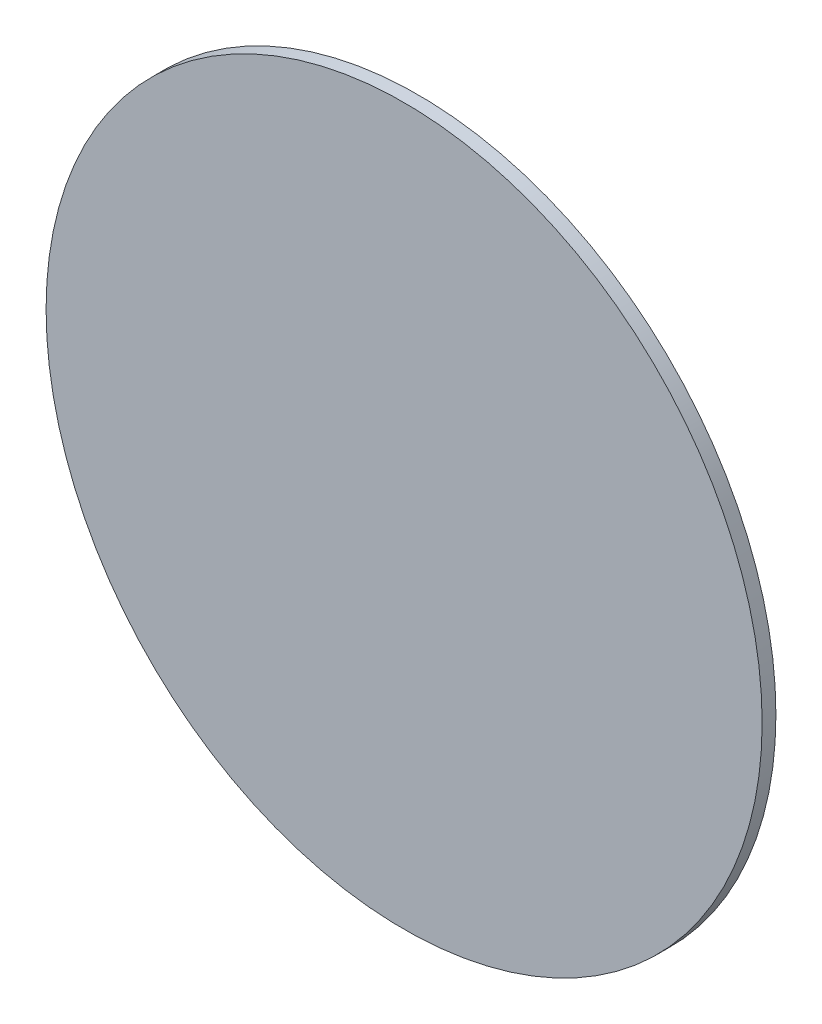
ISO-10303-21;
HEADER;
FILE_DESCRIPTION(('STEP AP214'),'2;1');
FILE_NAME('part.step','',(''),(''),'','','');
FILE_SCHEMA(('AUTOMOTIVE_DESIGN { 1 0 10303 214 1 1 1 1 }'));
ENDSEC;
DATA;
#1=APPLICATION_CONTEXT('core data for automotive mechanical design processes');
#2=APPLICATION_PROTOCOL_DEFINITION('international standard','automotive_design',2000,#1);
#3=PRODUCT_CONTEXT('',#1,'mechanical');
#4=PRODUCT('Part','Part','',(#3));
#5=PRODUCT_RELATED_PRODUCT_CATEGORY('part','',(#4));
#6=PRODUCT_DEFINITION_FORMATION('','',#4);
#7=PRODUCT_DEFINITION_CONTEXT('part definition',#1,'design');
#8=PRODUCT_DEFINITION('design','',#6,#7);
#9=PRODUCT_DEFINITION_SHAPE('','',#8);
#10=(LENGTH_UNIT() NAMED_UNIT(*) SI_UNIT(.MILLI.,.METRE.));
#11=(NAMED_UNIT(*) PLANE_ANGLE_UNIT() SI_UNIT($,.RADIAN.));
#12=(NAMED_UNIT(*) SI_UNIT($,.STERADIAN.) SOLID_ANGLE_UNIT());
#13=UNCERTAINTY_MEASURE_WITH_UNIT(LENGTH_MEASURE(1.E-05),#10,'distance_accuracy_value','');
#14=(GEOMETRIC_REPRESENTATION_CONTEXT(3) GLOBAL_UNCERTAINTY_ASSIGNED_CONTEXT((#13)) GLOBAL_UNIT_ASSIGNED_CONTEXT((#10,
#11,#12)) REPRESENTATION_CONTEXT('',''));
#15=CARTESIAN_POINT('',(0.,0.,0.));
#16=DIRECTION('',(0.,0.,1.));
#17=DIRECTION('',(1.,0.,0.));
#18=AXIS2_PLACEMENT_3D('',#15,#16,#17);
#19=CARTESIAN_POINT('',(0.,0.,3.175));
#20=DIRECTION('',(0.,0.,-1.));
#21=DIRECTION('',(-1.,0.,0.));
#22=AXIS2_PLACEMENT_3D('',#19,#20,#21);
#23=CYLINDRICAL_SURFACE('',#22,165.1);
#24=CARTESIAN_POINT('',(0.,0.,3.175));
#25=DIRECTION('',(0.,0.,1.));
#26=DIRECTION('',(1.,0.,0.));
#27=AXIS2_PLACEMENT_3D('',#24,#25,#26);
#28=CIRCLE('',#27,165.1);
#29=CARTESIAN_POINT('',(165.1,0.,3.175));
#30=VERTEX_POINT('',#29);
#31=EDGE_CURVE('E10',#30,#30,#28,.T.);
#32=ORIENTED_EDGE('',*,*,#31,.F.);
#33=EDGE_LOOP('',(#32));
#34=FACE_BOUND('',#33,.T.);
#35=CARTESIAN_POINT('',(0.,0.,-3.175));
#36=DIRECTION('',(0.,0.,1.));
#37=DIRECTION('',(1.,0.,0.));
#38=AXIS2_PLACEMENT_3D('',#35,#36,#37);
#39=CIRCLE('',#38,165.1);
#40=CARTESIAN_POINT('',(165.1,0.,-3.175));
#41=VERTEX_POINT('',#40);
#42=EDGE_CURVE('E36',#41,#41,#39,.T.);
#43=ORIENTED_EDGE('',*,*,#42,.T.);
#44=EDGE_LOOP('',(#43));
#45=FACE_BOUND('',#44,.T.);
#46=ADVANCED_FACE('F33',(#34,#45),#23,.T.);
#47=CARTESIAN_POINT('',(0.,0.,3.175));
#48=DIRECTION('',(0.,0.,1.));
#49=DIRECTION('',(1.,0.,0.));
#50=AXIS2_PLACEMENT_3D('',#47,#48,#49);
#51=PLANE('',#50);
#52=ORIENTED_EDGE('',*,*,#31,.T.);
#53=EDGE_LOOP('',(#52));
#54=FACE_BOUND('',#53,.T.);
#55=ADVANCED_FACE('F48',(#54),#51,.T.);
#56=CARTESIAN_POINT('',(0.,0.,-3.175));
#57=DIRECTION('',(0.,0.,1.));
#58=DIRECTION('',(1.,0.,0.));
#59=AXIS2_PLACEMENT_3D('',#56,#57,#58);
#60=PLANE('',#59);
#61=ORIENTED_EDGE('',*,*,#42,.F.);
#62=EDGE_LOOP('',(#61));
#63=FACE_BOUND('',#62,.T.);
#64=ADVANCED_FACE('F46',(#63),#60,.F.);
#65=CLOSED_SHELL('',(#46,#55,#64));
#66=MANIFOLD_SOLID_BREP('B2',#65);
#67=ADVANCED_BREP_SHAPE_REPRESENTATION('',(#18,#66),#14);
#68=SHAPE_DEFINITION_REPRESENTATION(#9,#67);
ENDSEC;
END-ISO-10303-21;
